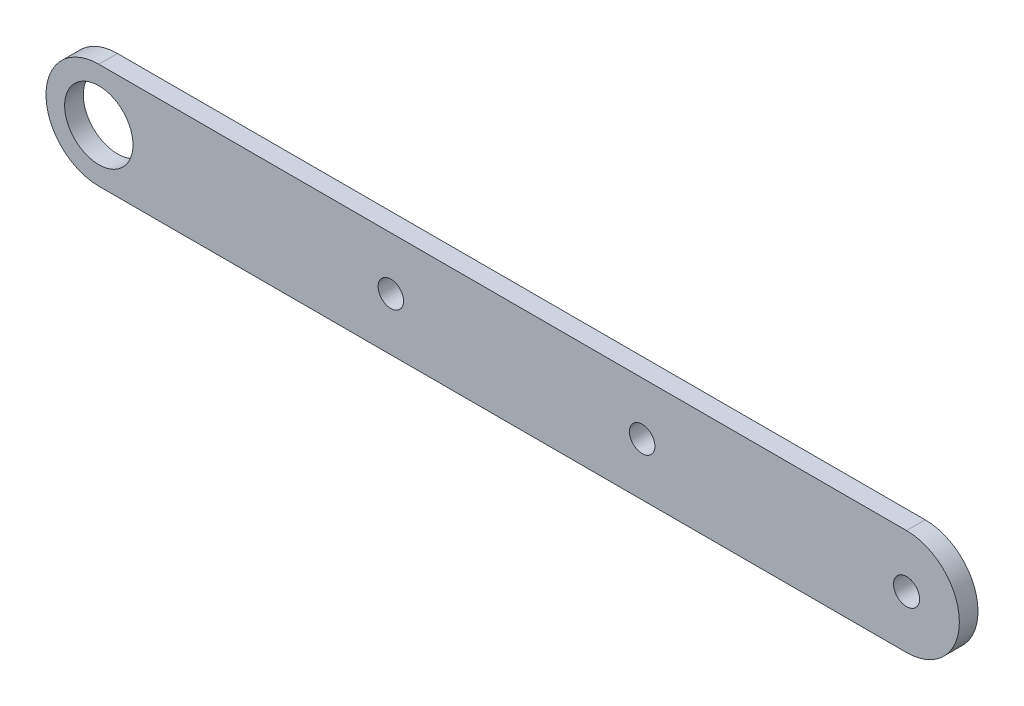
ISO-10303-21;
HEADER;
FILE_DESCRIPTION(('STEP AP214'),'2;1');
FILE_NAME('part.step','',(''),(''),'','','');
FILE_SCHEMA(('AUTOMOTIVE_DESIGN { 1 0 10303 214 1 1 1 1 }'));
ENDSEC;
DATA;
#1=APPLICATION_CONTEXT('core data for automotive mechanical design processes');
#2=APPLICATION_PROTOCOL_DEFINITION('international standard','automotive_design',2000,#1);
#3=PRODUCT_CONTEXT('',#1,'mechanical');
#4=PRODUCT('Part','Part','',(#3));
#5=PRODUCT_RELATED_PRODUCT_CATEGORY('part','',(#4));
#6=PRODUCT_DEFINITION_FORMATION('','',#4);
#7=PRODUCT_DEFINITION_CONTEXT('part definition',#1,'design');
#8=PRODUCT_DEFINITION('design','',#6,#7);
#9=PRODUCT_DEFINITION_SHAPE('','',#8);
#10=(LENGTH_UNIT() NAMED_UNIT(*) SI_UNIT(.MILLI.,.METRE.));
#11=(NAMED_UNIT(*) PLANE_ANGLE_UNIT() SI_UNIT($,.RADIAN.));
#12=(NAMED_UNIT(*) SI_UNIT($,.STERADIAN.) SOLID_ANGLE_UNIT());
#13=UNCERTAINTY_MEASURE_WITH_UNIT(LENGTH_MEASURE(1.E-05),#10,'distance_accuracy_value','');
#14=(GEOMETRIC_REPRESENTATION_CONTEXT(3) GLOBAL_UNCERTAINTY_ASSIGNED_CONTEXT((#13)) GLOBAL_UNIT_ASSIGNED_CONTEXT((#10,
#11,#12)) REPRESENTATION_CONTEXT('',''));
#15=CARTESIAN_POINT('',(0.,0.,0.));
#16=DIRECTION('',(0.,0.,1.));
#17=DIRECTION('',(1.,0.,0.));
#18=AXIS2_PLACEMENT_3D('',#15,#16,#17);
#19=CARTESIAN_POINT('',(-130.,0.,3.));
#20=DIRECTION('',(0.,0.,1.));
#21=DIRECTION('',(1.,0.,0.));
#22=AXIS2_PLACEMENT_3D('',#19,#20,#21);
#23=PLANE('',#22);
#24=CARTESIAN_POINT('',(-83.,0.,3.));
#25=DIRECTION('',(0.,0.,1.));
#26=DIRECTION('',(1.,0.,0.));
#27=AXIS2_PLACEMENT_3D('',#24,#25,#26);
#28=CIRCLE('',#27,2.04999999999999);
#29=CARTESIAN_POINT('',(-80.95,0.,3.));
#30=VERTEX_POINT('',#29);
#31=EDGE_CURVE('E122',#30,#30,#28,.T.);
#32=ORIENTED_EDGE('',*,*,#31,.F.);
#33=EDGE_LOOP('',(#32));
#34=FACE_BOUND('',#33,.T.);
#35=CARTESIAN_POINT('',(0.,0.,3.));
#36=DIRECTION('',(0.,0.,1.));
#37=DIRECTION('',(1.,0.,0.));
#38=AXIS2_PLACEMENT_3D('',#35,#36,#37);
#39=CIRCLE('',#38,2.1);
#40=CARTESIAN_POINT('',(2.1,0.,3.));
#41=VERTEX_POINT('',#40);
#42=EDGE_CURVE('E101',#41,#41,#39,.T.);
#43=ORIENTED_EDGE('',*,*,#42,.F.);
#44=EDGE_LOOP('',(#43));
#45=FACE_BOUND('',#44,.T.);
#46=CARTESIAN_POINT('',(-130.,0.,3.));
#47=DIRECTION('',(0.,0.,1.));
#48=DIRECTION('',(1.,0.,0.));
#49=AXIS2_PLACEMENT_3D('',#46,#47,#48);
#50=CIRCLE('',#49,8.5);
#51=CARTESIAN_POINT('',(-130.,8.5,3.));
#52=VERTEX_POINT('',#51);
#53=CARTESIAN_POINT('',(-130.,-8.5,3.));
#54=VERTEX_POINT('',#53);
#55=EDGE_CURVE('E86',#52,#54,#50,.T.);
#56=ORIENTED_EDGE('',*,*,#55,.T.);
#57=DIRECTION('',(1.,0.,0.));
#58=VECTOR('',#57,1.);
#59=CARTESIAN_POINT('',(-130.,-8.5,3.));
#60=LINE('',#59,#58);
#61=CARTESIAN_POINT('',(0.,-8.5,3.));
#62=VERTEX_POINT('',#61);
#63=EDGE_CURVE('E81',#54,#62,#60,.T.);
#64=ORIENTED_EDGE('',*,*,#63,.T.);
#65=CARTESIAN_POINT('',(0.,0.,3.));
#66=DIRECTION('',(0.,0.,1.));
#67=DIRECTION('',(1.,0.,0.));
#68=AXIS2_PLACEMENT_3D('',#65,#66,#67);
#69=CIRCLE('',#68,8.5);
#70=CARTESIAN_POINT('',(0.,8.5,3.));
#71=VERTEX_POINT('',#70);
#72=EDGE_CURVE('E84',#62,#71,#69,.T.);
#73=ORIENTED_EDGE('',*,*,#72,.T.);
#74=DIRECTION('',(-1.,0.,0.));
#75=VECTOR('',#74,1.);
#76=CARTESIAN_POINT('',(-130.,8.5,3.));
#77=LINE('',#76,#75);
#78=EDGE_CURVE('E51',#71,#52,#77,.T.);
#79=ORIENTED_EDGE('',*,*,#78,.T.);
#80=EDGE_LOOP('',(#56,#64,#73,#79));
#81=FACE_BOUND('',#80,.T.);
#82=CARTESIAN_POINT('',(-130.,0.,3.));
#83=DIRECTION('',(0.,0.,1.));
#84=DIRECTION('',(1.,0.,0.));
#85=AXIS2_PLACEMENT_3D('',#82,#83,#84);
#86=CIRCLE('',#85,5.5);
#87=CARTESIAN_POINT('',(-124.5,0.,3.));
#88=VERTEX_POINT('',#87);
#89=EDGE_CURVE('E116',#88,#88,#86,.T.);
#90=ORIENTED_EDGE('',*,*,#89,.F.);
#91=EDGE_LOOP('',(#90));
#92=FACE_BOUND('',#91,.T.);
#93=CARTESIAN_POINT('',(-42.55,0.,3.));
#94=DIRECTION('',(0.,0.,1.));
#95=DIRECTION('',(1.,0.,0.));
#96=AXIS2_PLACEMENT_3D('',#93,#94,#95);
#97=CIRCLE('',#96,2.05);
#98=CARTESIAN_POINT('',(-40.5,0.,3.));
#99=VERTEX_POINT('',#98);
#100=EDGE_CURVE('E128',#99,#99,#97,.T.);
#101=ORIENTED_EDGE('',*,*,#100,.F.);
#102=EDGE_LOOP('',(#101));
#103=FACE_BOUND('',#102,.T.);
#104=ADVANCED_FACE('F34',(#34,#45,#81,#92,#103),#23,.T.);
#105=CARTESIAN_POINT('',(-130.,0.,0.));
#106=DIRECTION('',(0.,0.,1.));
#107=DIRECTION('',(1.,0.,0.));
#108=AXIS2_PLACEMENT_3D('',#105,#106,#107);
#109=PLANE('',#108);
#110=CARTESIAN_POINT('',(-130.,0.,0.));
#111=DIRECTION('',(0.,0.,1.));
#112=DIRECTION('',(1.,0.,0.));
#113=AXIS2_PLACEMENT_3D('',#110,#111,#112);
#114=CIRCLE('',#113,8.5);
#115=CARTESIAN_POINT('',(-130.,8.5,0.));
#116=VERTEX_POINT('',#115);
#117=CARTESIAN_POINT('',(-130.,-8.5,0.));
#118=VERTEX_POINT('',#117);
#119=EDGE_CURVE('E98',#116,#118,#114,.T.);
#120=ORIENTED_EDGE('',*,*,#119,.F.);
#121=DIRECTION('',(-1.,0.,0.));
#122=VECTOR('',#121,1.);
#123=CARTESIAN_POINT('',(-130.,8.5,0.));
#124=LINE('',#123,#122);
#125=CARTESIAN_POINT('',(0.,8.5,0.));
#126=VERTEX_POINT('',#125);
#127=EDGE_CURVE('E74',#126,#116,#124,.T.);
#128=ORIENTED_EDGE('',*,*,#127,.F.);
#129=CARTESIAN_POINT('',(0.,0.,0.));
#130=DIRECTION('',(0.,0.,1.));
#131=DIRECTION('',(1.,0.,0.));
#132=AXIS2_PLACEMENT_3D('',#129,#130,#131);
#133=CIRCLE('',#132,8.5);
#134=CARTESIAN_POINT('',(0.,-8.5,0.));
#135=VERTEX_POINT('',#134);
#136=EDGE_CURVE('E68',#135,#126,#133,.T.);
#137=ORIENTED_EDGE('',*,*,#136,.F.);
#138=DIRECTION('',(1.,0.,0.));
#139=VECTOR('',#138,1.);
#140=CARTESIAN_POINT('',(-130.,-8.5,0.));
#141=LINE('',#140,#139);
#142=EDGE_CURVE('E90',#118,#135,#141,.T.);
#143=ORIENTED_EDGE('',*,*,#142,.F.);
#144=EDGE_LOOP('',(#120,#128,#137,#143));
#145=FACE_BOUND('',#144,.T.);
#146=CARTESIAN_POINT('',(0.,0.,0.));
#147=DIRECTION('',(0.,0.,1.));
#148=DIRECTION('',(1.,0.,0.));
#149=AXIS2_PLACEMENT_3D('',#146,#147,#148);
#150=CIRCLE('',#149,2.1);
#151=CARTESIAN_POINT('',(2.1,0.,0.));
#152=VERTEX_POINT('',#151);
#153=EDGE_CURVE('E113',#152,#152,#150,.T.);
#154=ORIENTED_EDGE('',*,*,#153,.T.);
#155=EDGE_LOOP('',(#154));
#156=FACE_BOUND('',#155,.T.);
#157=CARTESIAN_POINT('',(-130.,0.,0.));
#158=DIRECTION('',(0.,0.,1.));
#159=DIRECTION('',(1.,0.,0.));
#160=AXIS2_PLACEMENT_3D('',#157,#158,#159);
#161=CIRCLE('',#160,5.5);
#162=CARTESIAN_POINT('',(-124.5,0.,0.));
#163=VERTEX_POINT('',#162);
#164=EDGE_CURVE('E119',#163,#163,#161,.T.);
#165=ORIENTED_EDGE('',*,*,#164,.T.);
#166=EDGE_LOOP('',(#165));
#167=FACE_BOUND('',#166,.T.);
#168=CARTESIAN_POINT('',(-83.,0.,0.));
#169=DIRECTION('',(0.,0.,1.));
#170=DIRECTION('',(1.,0.,0.));
#171=AXIS2_PLACEMENT_3D('',#168,#169,#170);
#172=CIRCLE('',#171,2.04999999999999);
#173=CARTESIAN_POINT('',(-80.95,0.,0.));
#174=VERTEX_POINT('',#173);
#175=EDGE_CURVE('E125',#174,#174,#172,.T.);
#176=ORIENTED_EDGE('',*,*,#175,.T.);
#177=EDGE_LOOP('',(#176));
#178=FACE_BOUND('',#177,.T.);
#179=CARTESIAN_POINT('',(-42.55,0.,0.));
#180=DIRECTION('',(0.,0.,1.));
#181=DIRECTION('',(1.,0.,0.));
#182=AXIS2_PLACEMENT_3D('',#179,#180,#181);
#183=CIRCLE('',#182,2.05);
#184=CARTESIAN_POINT('',(-40.5,0.,0.));
#185=VERTEX_POINT('',#184);
#186=EDGE_CURVE('E131',#185,#185,#183,.T.);
#187=ORIENTED_EDGE('',*,*,#186,.T.);
#188=EDGE_LOOP('',(#187));
#189=FACE_BOUND('',#188,.T.);
#190=ADVANCED_FACE('F109',(#145,#156,#167,#178,#189),#109,.F.);
#191=CARTESIAN_POINT('',(-130.,0.,3.));
#192=DIRECTION('',(0.,0.,-1.));
#193=DIRECTION('',(-1.,0.,0.));
#194=AXIS2_PLACEMENT_3D('',#191,#192,#193);
#195=CYLINDRICAL_SURFACE('',#194,8.5);
#196=ORIENTED_EDGE('',*,*,#119,.T.);
#197=DIRECTION('',(0.,0.,-1.));
#198=VECTOR('',#197,1.);
#199=CARTESIAN_POINT('',(-130.,-8.5,3.));
#200=LINE('',#199,#198);
#201=EDGE_CURVE('E11',#54,#118,#200,.T.);
#202=ORIENTED_EDGE('',*,*,#201,.F.);
#203=ORIENTED_EDGE('',*,*,#55,.F.);
#204=DIRECTION('',(0.,0.,-1.));
#205=VECTOR('',#204,1.);
#206=CARTESIAN_POINT('',(-130.,8.5,3.));
#207=LINE('',#206,#205);
#208=EDGE_CURVE('E94',#52,#116,#207,.T.);
#209=ORIENTED_EDGE('',*,*,#208,.T.);
#210=EDGE_LOOP('',(#196,#202,#203,#209));
#211=FACE_BOUND('',#210,.T.);
#212=ADVANCED_FACE('F36',(#211),#195,.T.);
#213=CARTESIAN_POINT('',(-130.,-8.5,3.));
#214=DIRECTION('',(0.,1.,0.));
#215=DIRECTION('',(-1.,0.,0.));
#216=AXIS2_PLACEMENT_3D('',#213,#214,#215);
#217=PLANE('',#216);
#218=ORIENTED_EDGE('',*,*,#142,.T.);
#219=DIRECTION('',(0.,0.,-1.));
#220=VECTOR('',#219,1.);
#221=CARTESIAN_POINT('',(0.,-8.5,3.));
#222=LINE('',#221,#220);
#223=EDGE_CURVE('E43',#62,#135,#222,.T.);
#224=ORIENTED_EDGE('',*,*,#223,.F.);
#225=ORIENTED_EDGE('',*,*,#63,.F.);
#226=ORIENTED_EDGE('',*,*,#201,.T.);
#227=EDGE_LOOP('',(#218,#224,#225,#226));
#228=FACE_BOUND('',#227,.T.);
#229=ADVANCED_FACE('F89',(#228),#217,.F.);
#230=CARTESIAN_POINT('',(0.,0.,3.));
#231=DIRECTION('',(0.,0.,-1.));
#232=DIRECTION('',(-1.,0.,0.));
#233=AXIS2_PLACEMENT_3D('',#230,#231,#232);
#234=CYLINDRICAL_SURFACE('',#233,8.5);
#235=ORIENTED_EDGE('',*,*,#136,.T.);
#236=DIRECTION('',(0.,0.,-1.));
#237=VECTOR('',#236,1.);
#238=CARTESIAN_POINT('',(0.,8.5,3.));
#239=LINE('',#238,#237);
#240=EDGE_CURVE('E91',#71,#126,#239,.T.);
#241=ORIENTED_EDGE('',*,*,#240,.F.);
#242=ORIENTED_EDGE('',*,*,#72,.F.);
#243=ORIENTED_EDGE('',*,*,#223,.T.);
#244=EDGE_LOOP('',(#235,#241,#242,#243));
#245=FACE_BOUND('',#244,.T.);
#246=ADVANCED_FACE('F92',(#245),#234,.T.);
#247=CARTESIAN_POINT('',(-130.,8.5,3.));
#248=DIRECTION('',(0.,-1.,0.));
#249=DIRECTION('',(1.,0.,0.));
#250=AXIS2_PLACEMENT_3D('',#247,#248,#249);
#251=PLANE('',#250);
#252=ORIENTED_EDGE('',*,*,#127,.T.);
#253=ORIENTED_EDGE('',*,*,#208,.F.);
#254=ORIENTED_EDGE('',*,*,#78,.F.);
#255=ORIENTED_EDGE('',*,*,#240,.T.);
#256=EDGE_LOOP('',(#252,#253,#254,#255));
#257=FACE_BOUND('',#256,.T.);
#258=ADVANCED_FACE('F106',(#257),#251,.F.);
#259=CARTESIAN_POINT('',(0.,0.,3.));
#260=DIRECTION('',(0.,0.,-1.));
#261=DIRECTION('',(-1.,0.,0.));
#262=AXIS2_PLACEMENT_3D('',#259,#260,#261);
#263=CYLINDRICAL_SURFACE('',#262,2.1);
#264=ORIENTED_EDGE('',*,*,#42,.T.);
#265=EDGE_LOOP('',(#264));
#266=FACE_BOUND('',#265,.T.);
#267=ORIENTED_EDGE('',*,*,#153,.F.);
#268=EDGE_LOOP('',(#267));
#269=FACE_BOUND('',#268,.T.);
#270=ADVANCED_FACE('F150',(#266,#269),#263,.F.);
#271=CARTESIAN_POINT('',(-130.,0.,3.));
#272=DIRECTION('',(0.,0.,-1.));
#273=DIRECTION('',(-1.,0.,0.));
#274=AXIS2_PLACEMENT_3D('',#271,#272,#273);
#275=CYLINDRICAL_SURFACE('',#274,5.5);
#276=ORIENTED_EDGE('',*,*,#89,.T.);
#277=EDGE_LOOP('',(#276));
#278=FACE_BOUND('',#277,.T.);
#279=ORIENTED_EDGE('',*,*,#164,.F.);
#280=EDGE_LOOP('',(#279));
#281=FACE_BOUND('',#280,.T.);
#282=ADVANCED_FACE('F196',(#278,#281),#275,.F.);
#283=CARTESIAN_POINT('',(-83.,0.,3.));
#284=DIRECTION('',(0.,0.,-1.));
#285=DIRECTION('',(-1.,0.,0.));
#286=AXIS2_PLACEMENT_3D('',#283,#284,#285);
#287=CYLINDRICAL_SURFACE('',#286,2.04999999999999);
#288=ORIENTED_EDGE('',*,*,#31,.T.);
#289=EDGE_LOOP('',(#288));
#290=FACE_BOUND('',#289,.T.);
#291=ORIENTED_EDGE('',*,*,#175,.F.);
#292=EDGE_LOOP('',(#291));
#293=FACE_BOUND('',#292,.T.);
#294=ADVANCED_FACE('F204',(#290,#293),#287,.F.);
#295=CARTESIAN_POINT('',(-42.55,0.,3.));
#296=DIRECTION('',(0.,0.,-1.));
#297=DIRECTION('',(-1.,0.,0.));
#298=AXIS2_PLACEMENT_3D('',#295,#296,#297);
#299=CYLINDRICAL_SURFACE('',#298,2.05);
#300=ORIENTED_EDGE('',*,*,#100,.T.);
#301=EDGE_LOOP('',(#300));
#302=FACE_BOUND('',#301,.T.);
#303=ORIENTED_EDGE('',*,*,#186,.F.);
#304=EDGE_LOOP('',(#303));
#305=FACE_BOUND('',#304,.T.);
#306=ADVANCED_FACE('F137',(#302,#305),#299,.F.);
#307=CLOSED_SHELL('',(#104,#190,#212,#229,#246,#258,#270,#282,#294,#306));
#308=MANIFOLD_SOLID_BREP('B2',#307);
#309=ADVANCED_BREP_SHAPE_REPRESENTATION('',(#18,#308),#14);
#310=SHAPE_DEFINITION_REPRESENTATION(#9,#309);
ENDSEC;
END-ISO-10303-21;
